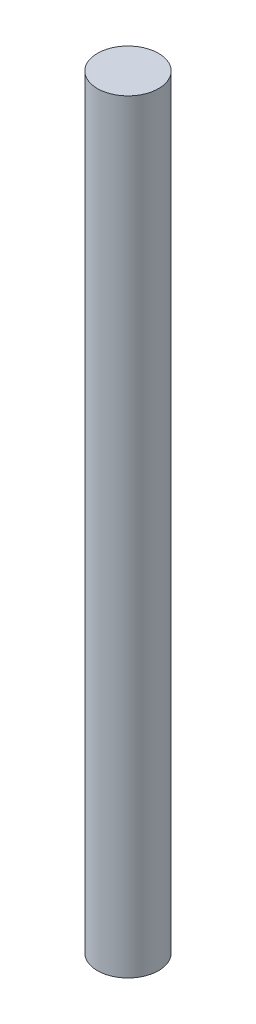
ISO-10303-21;
HEADER;
FILE_DESCRIPTION(('STEP AP214'),'2;1');
FILE_NAME('part.step','',(''),(''),'','','');
FILE_SCHEMA(('AUTOMOTIVE_DESIGN { 1 0 10303 214 1 1 1 1 }'));
ENDSEC;
DATA;
#1=APPLICATION_CONTEXT('core data for automotive mechanical design processes');
#2=APPLICATION_PROTOCOL_DEFINITION('international standard','automotive_design',2000,#1);
#3=PRODUCT_CONTEXT('',#1,'mechanical');
#4=PRODUCT('Part','Part','',(#3));
#5=PRODUCT_RELATED_PRODUCT_CATEGORY('part','',(#4));
#6=PRODUCT_DEFINITION_FORMATION('','',#4);
#7=PRODUCT_DEFINITION_CONTEXT('part definition',#1,'design');
#8=PRODUCT_DEFINITION('design','',#6,#7);
#9=PRODUCT_DEFINITION_SHAPE('','',#8);
#10=(LENGTH_UNIT() NAMED_UNIT(*) SI_UNIT(.MILLI.,.METRE.));
#11=(NAMED_UNIT(*) PLANE_ANGLE_UNIT() SI_UNIT($,.RADIAN.));
#12=(NAMED_UNIT(*) SI_UNIT($,.STERADIAN.) SOLID_ANGLE_UNIT());
#13=UNCERTAINTY_MEASURE_WITH_UNIT(LENGTH_MEASURE(1.E-05),#10,'distance_accuracy_value','');
#14=(GEOMETRIC_REPRESENTATION_CONTEXT(3) GLOBAL_UNCERTAINTY_ASSIGNED_CONTEXT((#13)) GLOBAL_UNIT_ASSIGNED_CONTEXT((#10,
#11,#12)) REPRESENTATION_CONTEXT('',''));
#15=CARTESIAN_POINT('',(0.,0.,0.));
#16=DIRECTION('',(0.,0.,1.));
#17=DIRECTION('',(1.,0.,0.));
#18=AXIS2_PLACEMENT_3D('',#15,#16,#17);
#19=CARTESIAN_POINT('',(0.,250.,0.));
#20=DIRECTION('',(0.,-1.,0.));
#21=DIRECTION('',(0.,0.,-1.));
#22=AXIS2_PLACEMENT_3D('',#19,#20,#21);
#23=CYLINDRICAL_SURFACE('',#22,10.);
#24=CARTESIAN_POINT('',(0.,250.,0.));
#25=DIRECTION('',(0.,1.,0.));
#26=DIRECTION('',(0.,0.,1.));
#27=AXIS2_PLACEMENT_3D('',#24,#25,#26);
#28=CIRCLE('',#27,10.);
#29=CARTESIAN_POINT('',(0.,250.,10.));
#30=VERTEX_POINT('',#29);
#31=EDGE_CURVE('E10',#30,#30,#28,.T.);
#32=ORIENTED_EDGE('',*,*,#31,.F.);
#33=EDGE_LOOP('',(#32));
#34=FACE_BOUND('',#33,.T.);
#35=CARTESIAN_POINT('',(0.,0.,0.));
#36=DIRECTION('',(0.,1.,0.));
#37=DIRECTION('',(0.,0.,1.));
#38=AXIS2_PLACEMENT_3D('',#35,#36,#37);
#39=CIRCLE('',#38,10.);
#40=CARTESIAN_POINT('',(0.,0.,10.));
#41=VERTEX_POINT('',#40);
#42=EDGE_CURVE('E34',#41,#41,#39,.T.);
#43=ORIENTED_EDGE('',*,*,#42,.T.);
#44=EDGE_LOOP('',(#43));
#45=FACE_BOUND('',#44,.T.);
#46=ADVANCED_FACE('F31',(#34,#45),#23,.T.);
#47=CARTESIAN_POINT('',(0.,250.,0.));
#48=DIRECTION('',(0.,1.,0.));
#49=DIRECTION('',(0.,0.,1.));
#50=AXIS2_PLACEMENT_3D('',#47,#48,#49);
#51=PLANE('',#50);
#52=ORIENTED_EDGE('',*,*,#31,.T.);
#53=EDGE_LOOP('',(#52));
#54=FACE_BOUND('',#53,.T.);
#55=ADVANCED_FACE('F46',(#54),#51,.T.);
#56=CARTESIAN_POINT('',(0.,0.,0.));
#57=DIRECTION('',(0.,1.,0.));
#58=DIRECTION('',(0.,0.,1.));
#59=AXIS2_PLACEMENT_3D('',#56,#57,#58);
#60=PLANE('',#59);
#61=ORIENTED_EDGE('',*,*,#42,.F.);
#62=EDGE_LOOP('',(#61));
#63=FACE_BOUND('',#62,.T.);
#64=ADVANCED_FACE('F44',(#63),#60,.F.);
#65=CLOSED_SHELL('',(#46,#55,#64));
#66=MANIFOLD_SOLID_BREP('B2',#65);
#67=ADVANCED_BREP_SHAPE_REPRESENTATION('',(#18,#66),#14);
#68=SHAPE_DEFINITION_REPRESENTATION(#9,#67);
ENDSEC;
END-ISO-10303-21;
